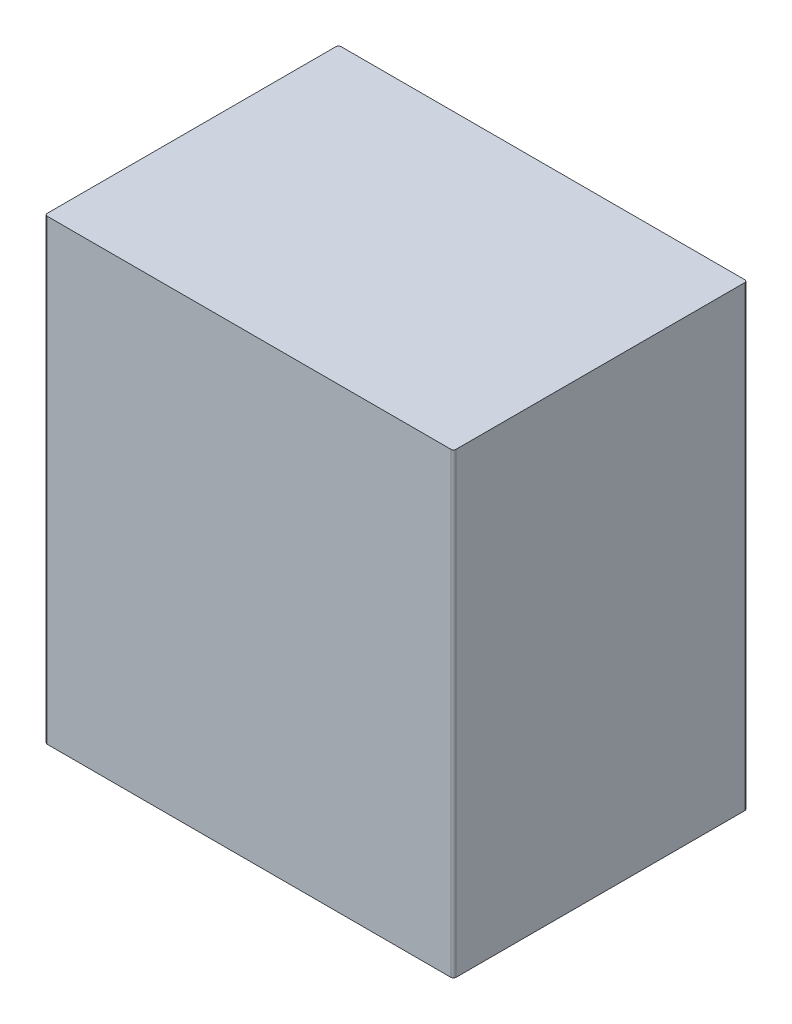
ISO-10303-21;
HEADER;
FILE_DESCRIPTION(('STEP AP214'),'2;1');
FILE_NAME('part.step','',(''),(''),'','','');
FILE_SCHEMA(('AUTOMOTIVE_DESIGN { 1 0 10303 214 1 1 1 1 }'));
ENDSEC;
DATA;
#1=APPLICATION_CONTEXT('core data for automotive mechanical design processes');
#2=APPLICATION_PROTOCOL_DEFINITION('international standard','automotive_design',2000,#1);
#3=PRODUCT_CONTEXT('',#1,'mechanical');
#4=PRODUCT('Part','Part','',(#3));
#5=PRODUCT_RELATED_PRODUCT_CATEGORY('part','',(#4));
#6=PRODUCT_DEFINITION_FORMATION('','',#4);
#7=PRODUCT_DEFINITION_CONTEXT('part definition',#1,'design');
#8=PRODUCT_DEFINITION('design','',#6,#7);
#9=PRODUCT_DEFINITION_SHAPE('','',#8);
#10=(LENGTH_UNIT() NAMED_UNIT(*) SI_UNIT(.MILLI.,.METRE.));
#11=(NAMED_UNIT(*) PLANE_ANGLE_UNIT() SI_UNIT($,.RADIAN.));
#12=(NAMED_UNIT(*) SI_UNIT($,.STERADIAN.) SOLID_ANGLE_UNIT());
#13=UNCERTAINTY_MEASURE_WITH_UNIT(LENGTH_MEASURE(1.E-05),#10,'distance_accuracy_value','');
#14=(GEOMETRIC_REPRESENTATION_CONTEXT(3) GLOBAL_UNCERTAINTY_ASSIGNED_CONTEXT((#13)) GLOBAL_UNIT_ASSIGNED_CONTEXT((#10,
#11,#12)) REPRESENTATION_CONTEXT('',''));
#15=CARTESIAN_POINT('',(0.,0.,0.));
#16=DIRECTION('',(0.,0.,1.));
#17=DIRECTION('',(1.,0.,0.));
#18=AXIS2_PLACEMENT_3D('',#15,#16,#17);
#19=CARTESIAN_POINT('',(-1.58,1.79,-1.13));
#20=DIRECTION('',(0.,1.,0.));
#21=DIRECTION('',(0.,0.,1.));
#22=AXIS2_PLACEMENT_3D('',#19,#20,#21);
#23=CYLINDRICAL_SURFACE('',#22,0.02);
#24=CARTESIAN_POINT('',(-1.58,-1.79,-1.13));
#25=DIRECTION('',(0.,1.,0.));
#26=DIRECTION('',(0.,0.,1.));
#27=AXIS2_PLACEMENT_3D('',#24,#25,#26);
#28=CIRCLE('',#27,0.02);
#29=CARTESIAN_POINT('',(-1.58,-1.79,-1.15));
#30=VERTEX_POINT('',#29);
#31=CARTESIAN_POINT('',(-1.6,-1.79,-1.13));
#32=VERTEX_POINT('',#31);
#33=EDGE_CURVE('E86',#30,#32,#28,.T.);
#34=ORIENTED_EDGE('',*,*,#33,.T.);
#35=DIRECTION('',(0.,1.,0.));
#36=VECTOR('',#35,1.);
#37=CARTESIAN_POINT('',(-1.6,1.79,-1.13));
#38=LINE('',#37,#36);
#39=CARTESIAN_POINT('',(-1.6,1.79,-1.13));
#40=VERTEX_POINT('',#39);
#41=EDGE_CURVE('E84',#32,#40,#38,.T.);
#42=ORIENTED_EDGE('',*,*,#41,.T.);
#43=CARTESIAN_POINT('',(-1.58,1.79,-1.13));
#44=DIRECTION('',(0.,1.,0.));
#45=DIRECTION('',(0.,0.,1.));
#46=AXIS2_PLACEMENT_3D('',#43,#44,#45);
#47=CIRCLE('',#46,0.02);
#48=CARTESIAN_POINT('',(-1.58,1.79,-1.15));
#49=VERTEX_POINT('',#48);
#50=EDGE_CURVE('E20',#40,#49,#47,.F.);
#51=ORIENTED_EDGE('',*,*,#50,.T.);
#52=DIRECTION('',(0.,1.,0.));
#53=VECTOR('',#52,1.);
#54=CARTESIAN_POINT('',(-1.58,-1.79,-1.15));
#55=LINE('',#54,#53);
#56=EDGE_CURVE('E81',#49,#30,#55,.F.);
#57=ORIENTED_EDGE('',*,*,#56,.T.);
#58=EDGE_LOOP('',(#34,#42,#51,#57));
#59=FACE_BOUND('',#58,.T.);
#60=ADVANCED_FACE('F17',(#59),#23,.T.);
#61=CARTESIAN_POINT('',(1.58,-1.79,-1.13));
#62=DIRECTION('',(0.,-1.,0.));
#63=DIRECTION('',(0.,0.,-1.));
#64=AXIS2_PLACEMENT_3D('',#61,#62,#63);
#65=CYLINDRICAL_SURFACE('',#64,0.02);
#66=CARTESIAN_POINT('',(1.58,1.79,-1.13));
#67=DIRECTION('',(0.,-1.,0.));
#68=DIRECTION('',(0.,0.,-1.));
#69=AXIS2_PLACEMENT_3D('',#66,#67,#68);
#70=CIRCLE('',#69,0.02);
#71=CARTESIAN_POINT('',(1.58,1.79,-1.15));
#72=VERTEX_POINT('',#71);
#73=CARTESIAN_POINT('',(1.6,1.79,-1.13));
#74=VERTEX_POINT('',#73);
#75=EDGE_CURVE('E98',#72,#74,#70,.T.);
#76=ORIENTED_EDGE('',*,*,#75,.T.);
#77=DIRECTION('',(0.,1.,0.));
#78=VECTOR('',#77,1.);
#79=CARTESIAN_POINT('',(1.6,-1.79,-1.13));
#80=LINE('',#79,#78);
#81=CARTESIAN_POINT('',(1.6,-1.79,-1.13));
#82=VERTEX_POINT('',#81);
#83=EDGE_CURVE('E101',#74,#82,#80,.F.);
#84=ORIENTED_EDGE('',*,*,#83,.T.);
#85=CARTESIAN_POINT('',(1.58,-1.79,-1.13));
#86=DIRECTION('',(0.,-1.,0.));
#87=DIRECTION('',(0.,0.,-1.));
#88=AXIS2_PLACEMENT_3D('',#85,#86,#87);
#89=CIRCLE('',#88,0.02);
#90=CARTESIAN_POINT('',(1.58,-1.79,-1.15));
#91=VERTEX_POINT('',#90);
#92=EDGE_CURVE('E131',#82,#91,#89,.F.);
#93=ORIENTED_EDGE('',*,*,#92,.T.);
#94=DIRECTION('',(0.,1.,0.));
#95=VECTOR('',#94,1.);
#96=CARTESIAN_POINT('',(1.58,-1.79,-1.15));
#97=LINE('',#96,#95);
#98=EDGE_CURVE('E94',#91,#72,#97,.T.);
#99=ORIENTED_EDGE('',*,*,#98,.T.);
#100=EDGE_LOOP('',(#76,#84,#93,#99));
#101=FACE_BOUND('',#100,.T.);
#102=ADVANCED_FACE('F161',(#101),#65,.T.);
#103=CARTESIAN_POINT('',(-1.6,-1.79,-1.15));
#104=DIRECTION('',(0.,0.,1.));
#105=DIRECTION('',(1.,0.,0.));
#106=AXIS2_PLACEMENT_3D('',#103,#104,#105);
#107=PLANE('',#106);
#108=ORIENTED_EDGE('',*,*,#56,.F.);
#109=DIRECTION('',(1.,0.,0.));
#110=VECTOR('',#109,1.);
#111=CARTESIAN_POINT('',(1.6,1.79,-1.15));
#112=LINE('',#111,#110);
#113=EDGE_CURVE('E91',#49,#72,#112,.T.);
#114=ORIENTED_EDGE('',*,*,#113,.T.);
#115=ORIENTED_EDGE('',*,*,#98,.F.);
#116=DIRECTION('',(1.,0.,0.));
#117=VECTOR('',#116,1.);
#118=CARTESIAN_POINT('',(-1.6,-1.79,-1.15));
#119=LINE('',#118,#117);
#120=EDGE_CURVE('E93',#91,#30,#119,.F.);
#121=ORIENTED_EDGE('',*,*,#120,.T.);
#122=EDGE_LOOP('',(#108,#114,#115,#121));
#123=FACE_BOUND('',#122,.T.);
#124=ADVANCED_FACE('F89',(#123),#107,.F.);
#125=CARTESIAN_POINT('',(-1.6,1.79,1.15));
#126=DIRECTION('',(1.,0.,0.));
#127=DIRECTION('',(0.,0.,-1.));
#128=AXIS2_PLACEMENT_3D('',#125,#126,#127);
#129=PLANE('',#128);
#130=DIRECTION('',(0.,-1.,0.));
#131=VECTOR('',#130,1.);
#132=CARTESIAN_POINT('',(-1.6,-1.79,1.13));
#133=LINE('',#132,#131);
#134=CARTESIAN_POINT('',(-1.6,1.79,1.13));
#135=VERTEX_POINT('',#134);
#136=CARTESIAN_POINT('',(-1.6,-1.79,1.13));
#137=VERTEX_POINT('',#136);
#138=EDGE_CURVE('E114',#135,#137,#133,.T.);
#139=ORIENTED_EDGE('',*,*,#138,.F.);
#140=DIRECTION('',(0.,0.,-1.));
#141=VECTOR('',#140,1.);
#142=CARTESIAN_POINT('',(-1.6,1.79,1.15));
#143=LINE('',#142,#141);
#144=EDGE_CURVE('E104',#135,#40,#143,.T.);
#145=ORIENTED_EDGE('',*,*,#144,.T.);
#146=ORIENTED_EDGE('',*,*,#41,.F.);
#147=DIRECTION('',(0.,0.,1.));
#148=VECTOR('',#147,1.);
#149=CARTESIAN_POINT('',(-1.6,-1.79,1.15));
#150=LINE('',#149,#148);
#151=EDGE_CURVE('E127',#32,#137,#150,.T.);
#152=ORIENTED_EDGE('',*,*,#151,.T.);
#153=EDGE_LOOP('',(#139,#145,#146,#152));
#154=FACE_BOUND('',#153,.T.);
#155=ADVANCED_FACE('F135',(#154),#129,.F.);
#156=CARTESIAN_POINT('',(1.6,-1.79,1.15));
#157=DIRECTION('',(-1.,0.,0.));
#158=DIRECTION('',(0.,0.,1.));
#159=AXIS2_PLACEMENT_3D('',#156,#157,#158);
#160=PLANE('',#159);
#161=ORIENTED_EDGE('',*,*,#83,.F.);
#162=DIRECTION('',(0.,0.,-1.));
#163=VECTOR('',#162,1.);
#164=CARTESIAN_POINT('',(1.6,1.79,1.15));
#165=LINE('',#164,#163);
#166=CARTESIAN_POINT('',(1.6,1.79,1.13));
#167=VERTEX_POINT('',#166);
#168=EDGE_CURVE('E100',#74,#167,#165,.F.);
#169=ORIENTED_EDGE('',*,*,#168,.T.);
#170=DIRECTION('',(0.,1.,0.));
#171=VECTOR('',#170,1.);
#172=CARTESIAN_POINT('',(1.6,-1.79,1.13));
#173=LINE('',#172,#171);
#174=CARTESIAN_POINT('',(1.6,-1.79,1.13));
#175=VERTEX_POINT('',#174);
#176=EDGE_CURVE('E110',#175,#167,#173,.T.);
#177=ORIENTED_EDGE('',*,*,#176,.F.);
#178=DIRECTION('',(0.,0.,1.));
#179=VECTOR('',#178,1.);
#180=CARTESIAN_POINT('',(1.6,-1.79,1.15));
#181=LINE('',#180,#179);
#182=EDGE_CURVE('E117',#175,#82,#181,.F.);
#183=ORIENTED_EDGE('',*,*,#182,.T.);
#184=EDGE_LOOP('',(#161,#169,#177,#183));
#185=FACE_BOUND('',#184,.T.);
#186=ADVANCED_FACE('F159',(#185),#160,.F.);
#187=CARTESIAN_POINT('',(1.6,1.79,1.15));
#188=DIRECTION('',(0.,-1.,0.));
#189=DIRECTION('',(0.,0.,-1.));
#190=AXIS2_PLACEMENT_3D('',#187,#188,#189);
#191=PLANE('',#190);
#192=CARTESIAN_POINT('',(-1.58,1.79,1.13));
#193=DIRECTION('',(0.,-1.,0.));
#194=DIRECTION('',(0.,0.,-1.));
#195=AXIS2_PLACEMENT_3D('',#192,#193,#194);
#196=CIRCLE('',#195,0.02);
#197=CARTESIAN_POINT('',(-1.58,1.79,1.15));
#198=VERTEX_POINT('',#197);
#199=EDGE_CURVE('E118',#198,#135,#196,.T.);
#200=ORIENTED_EDGE('',*,*,#199,.F.);
#201=DIRECTION('',(1.,0.,0.));
#202=VECTOR('',#201,1.);
#203=CARTESIAN_POINT('',(-1.6,1.79,1.15));
#204=LINE('',#203,#202);
#205=CARTESIAN_POINT('',(1.58,1.79,1.15));
#206=VERTEX_POINT('',#205);
#207=EDGE_CURVE('E123',#206,#198,#204,.F.);
#208=ORIENTED_EDGE('',*,*,#207,.F.);
#209=CARTESIAN_POINT('',(1.58,1.79,1.13));
#210=DIRECTION('',(0.,1.,0.));
#211=DIRECTION('',(0.,0.,1.));
#212=AXIS2_PLACEMENT_3D('',#209,#210,#211);
#213=CIRCLE('',#212,0.02);
#214=EDGE_CURVE('E113',#167,#206,#213,.F.);
#215=ORIENTED_EDGE('',*,*,#214,.F.);
#216=ORIENTED_EDGE('',*,*,#168,.F.);
#217=ORIENTED_EDGE('',*,*,#75,.F.);
#218=ORIENTED_EDGE('',*,*,#113,.F.);
#219=ORIENTED_EDGE('',*,*,#50,.F.);
#220=ORIENTED_EDGE('',*,*,#144,.F.);
#221=EDGE_LOOP('',(#200,#208,#215,#216,#217,#218,#219,#220));
#222=FACE_BOUND('',#221,.T.);
#223=ADVANCED_FACE('F96',(#222),#191,.F.);
#224=CARTESIAN_POINT('',(-1.58,-1.79,1.13));
#225=DIRECTION('',(0.,-1.,0.));
#226=DIRECTION('',(0.,0.,-1.));
#227=AXIS2_PLACEMENT_3D('',#224,#225,#226);
#228=CYLINDRICAL_SURFACE('',#227,0.02);
#229=CARTESIAN_POINT('',(-1.58,-1.79,1.13));
#230=DIRECTION('',(0.,-1.,0.));
#231=DIRECTION('',(0.,0.,-1.));
#232=AXIS2_PLACEMENT_3D('',#229,#230,#231);
#233=CIRCLE('',#232,0.02);
#234=CARTESIAN_POINT('',(-1.58,-1.79,1.15));
#235=VERTEX_POINT('',#234);
#236=EDGE_CURVE('E125',#137,#235,#233,.F.);
#237=ORIENTED_EDGE('',*,*,#236,.T.);
#238=DIRECTION('',(0.,1.,0.));
#239=VECTOR('',#238,1.);
#240=CARTESIAN_POINT('',(-1.58,-1.79,1.15));
#241=LINE('',#240,#239);
#242=EDGE_CURVE('E143',#198,#235,#241,.F.);
#243=ORIENTED_EDGE('',*,*,#242,.F.);
#244=ORIENTED_EDGE('',*,*,#199,.T.);
#245=ORIENTED_EDGE('',*,*,#138,.T.);
#246=EDGE_LOOP('',(#237,#243,#244,#245));
#247=FACE_BOUND('',#246,.T.);
#248=ADVANCED_FACE('F178',(#247),#228,.T.);
#249=CARTESIAN_POINT('',(-1.6,-1.79,1.15));
#250=DIRECTION('',(0.,1.,0.));
#251=DIRECTION('',(0.,0.,1.));
#252=AXIS2_PLACEMENT_3D('',#249,#250,#251);
#253=PLANE('',#252);
#254=ORIENTED_EDGE('',*,*,#236,.F.);
#255=ORIENTED_EDGE('',*,*,#151,.F.);
#256=ORIENTED_EDGE('',*,*,#33,.F.);
#257=ORIENTED_EDGE('',*,*,#120,.F.);
#258=ORIENTED_EDGE('',*,*,#92,.F.);
#259=ORIENTED_EDGE('',*,*,#182,.F.);
#260=CARTESIAN_POINT('',(1.58,-1.79,1.13));
#261=DIRECTION('',(0.,1.,0.));
#262=DIRECTION('',(0.,0.,1.));
#263=AXIS2_PLACEMENT_3D('',#260,#261,#262);
#264=CIRCLE('',#263,0.02);
#265=CARTESIAN_POINT('',(1.58,-1.79,1.15));
#266=VERTEX_POINT('',#265);
#267=EDGE_CURVE('E35',#266,#175,#264,.T.);
#268=ORIENTED_EDGE('',*,*,#267,.F.);
#269=DIRECTION('',(1.,0.,0.));
#270=VECTOR('',#269,1.);
#271=CARTESIAN_POINT('',(-1.6,-1.79,1.15));
#272=LINE('',#271,#270);
#273=EDGE_CURVE('E26',#235,#266,#272,.T.);
#274=ORIENTED_EDGE('',*,*,#273,.F.);
#275=EDGE_LOOP('',(#254,#255,#256,#257,#258,#259,#268,#274));
#276=FACE_BOUND('',#275,.T.);
#277=ADVANCED_FACE('F137',(#276),#253,.F.);
#278=CARTESIAN_POINT('',(1.58,-1.79,1.13));
#279=DIRECTION('',(0.,1.,0.));
#280=DIRECTION('',(0.,0.,1.));
#281=AXIS2_PLACEMENT_3D('',#278,#279,#280);
#282=CYLINDRICAL_SURFACE('',#281,0.02);
#283=ORIENTED_EDGE('',*,*,#214,.T.);
#284=DIRECTION('',(0.,1.,0.));
#285=VECTOR('',#284,1.);
#286=CARTESIAN_POINT('',(1.58,-1.79,1.15));
#287=LINE('',#286,#285);
#288=EDGE_CURVE('E11',#266,#206,#287,.T.);
#289=ORIENTED_EDGE('',*,*,#288,.F.);
#290=ORIENTED_EDGE('',*,*,#267,.T.);
#291=ORIENTED_EDGE('',*,*,#176,.T.);
#292=EDGE_LOOP('',(#283,#289,#290,#291));
#293=FACE_BOUND('',#292,.T.);
#294=ADVANCED_FACE('F155',(#293),#282,.T.);
#295=CARTESIAN_POINT('',(-1.6,-1.79,1.15));
#296=DIRECTION('',(0.,0.,1.));
#297=DIRECTION('',(1.,0.,0.));
#298=AXIS2_PLACEMENT_3D('',#295,#296,#297);
#299=PLANE('',#298);
#300=ORIENTED_EDGE('',*,*,#273,.T.);
#301=ORIENTED_EDGE('',*,*,#288,.T.);
#302=ORIENTED_EDGE('',*,*,#207,.T.);
#303=ORIENTED_EDGE('',*,*,#242,.T.);
#304=EDGE_LOOP('',(#300,#301,#302,#303));
#305=FACE_BOUND('',#304,.T.);
#306=ADVANCED_FACE('F151',(#305),#299,.T.);
#307=CLOSED_SHELL('',(#60,#102,#124,#155,#186,#223,#248,#277,#294,#306));
#308=MANIFOLD_SOLID_BREP('B1',#307);
#309=ADVANCED_BREP_SHAPE_REPRESENTATION('',(#18,#308),#14);
#310=SHAPE_DEFINITION_REPRESENTATION(#9,#309);
ENDSEC;
END-ISO-10303-21;
